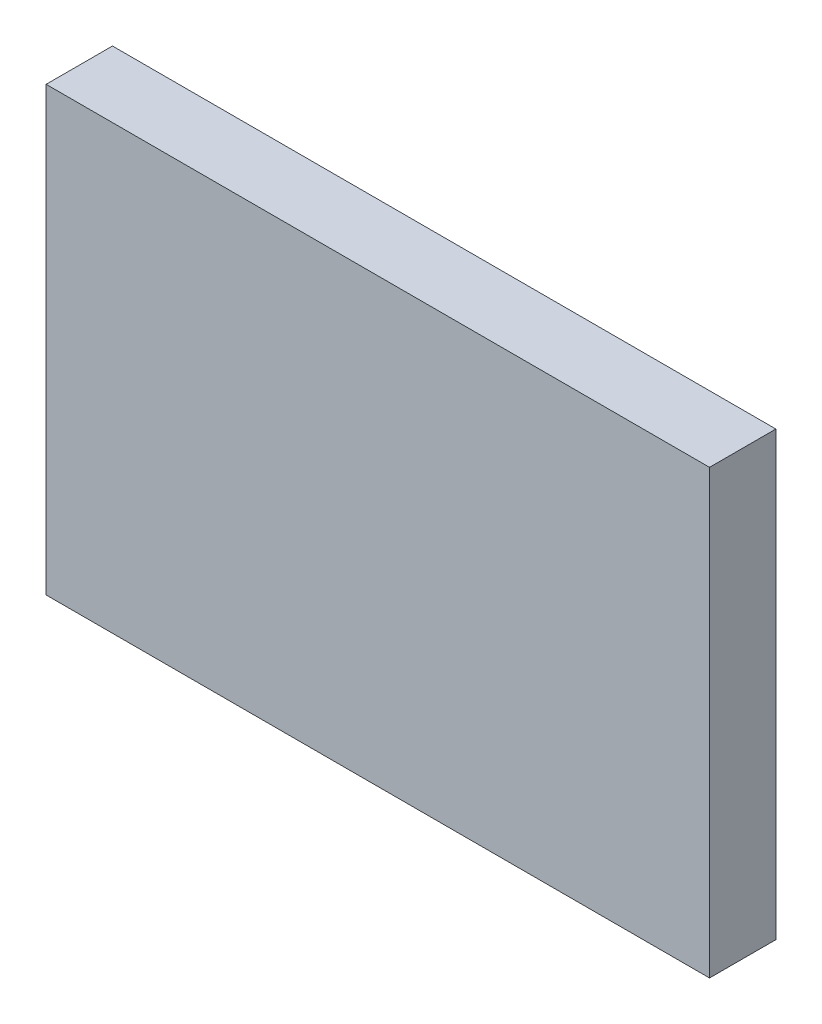
ISO-10303-21;
HEADER;
FILE_DESCRIPTION(('STEP AP214'),'2;1');
FILE_NAME('part.step','',(''),(''),'','','');
FILE_SCHEMA(('AUTOMOTIVE_DESIGN { 1 0 10303 214 1 1 1 1 }'));
ENDSEC;
DATA;
#1=APPLICATION_CONTEXT('core data for automotive mechanical design processes');
#2=APPLICATION_PROTOCOL_DEFINITION('international standard','automotive_design',2000,#1);
#3=PRODUCT_CONTEXT('',#1,'mechanical');
#4=PRODUCT('Part','Part','',(#3));
#5=PRODUCT_RELATED_PRODUCT_CATEGORY('part','',(#4));
#6=PRODUCT_DEFINITION_FORMATION('','',#4);
#7=PRODUCT_DEFINITION_CONTEXT('part definition',#1,'design');
#8=PRODUCT_DEFINITION('design','',#6,#7);
#9=PRODUCT_DEFINITION_SHAPE('','',#8);
#10=(LENGTH_UNIT() NAMED_UNIT(*) SI_UNIT(.MILLI.,.METRE.));
#11=(NAMED_UNIT(*) PLANE_ANGLE_UNIT() SI_UNIT($,.RADIAN.));
#12=(NAMED_UNIT(*) SI_UNIT($,.STERADIAN.) SOLID_ANGLE_UNIT());
#13=UNCERTAINTY_MEASURE_WITH_UNIT(LENGTH_MEASURE(1.E-05),#10,'distance_accuracy_value','');
#14=(GEOMETRIC_REPRESENTATION_CONTEXT(3) GLOBAL_UNCERTAINTY_ASSIGNED_CONTEXT((#13)) GLOBAL_UNIT_ASSIGNED_CONTEXT((#10,
#11,#12)) REPRESENTATION_CONTEXT('',''));
#15=CARTESIAN_POINT('',(0.,0.,0.));
#16=DIRECTION('',(0.,0.,1.));
#17=DIRECTION('',(1.,0.,0.));
#18=AXIS2_PLACEMENT_3D('',#15,#16,#17);
#19=CARTESIAN_POINT('',(15.,-10.,3.));
#20=DIRECTION('',(-1.,0.,0.));
#21=DIRECTION('',(0.,0.,1.));
#22=AXIS2_PLACEMENT_3D('',#19,#20,#21);
#23=PLANE('',#22);
#24=DIRECTION('',(0.,1.,0.));
#25=VECTOR('',#24,1.);
#26=CARTESIAN_POINT('',(15.,-10.,0.));
#27=LINE('',#26,#25);
#28=CARTESIAN_POINT('',(15.,-10.,0.));
#29=VERTEX_POINT('',#28);
#30=CARTESIAN_POINT('',(15.,10.,0.));
#31=VERTEX_POINT('',#30);
#32=EDGE_CURVE('E99',#29,#31,#27,.T.);
#33=ORIENTED_EDGE('',*,*,#32,.T.);
#34=DIRECTION('',(0.,0.,-1.));
#35=VECTOR('',#34,1.);
#36=CARTESIAN_POINT('',(15.,10.,3.));
#37=LINE('',#36,#35);
#38=CARTESIAN_POINT('',(15.,10.,3.));
#39=VERTEX_POINT('',#38);
#40=EDGE_CURVE('E11',#39,#31,#37,.T.);
#41=ORIENTED_EDGE('',*,*,#40,.F.);
#42=DIRECTION('',(0.,1.,0.));
#43=VECTOR('',#42,1.);
#44=CARTESIAN_POINT('',(15.,-10.,3.));
#45=LINE('',#44,#43);
#46=CARTESIAN_POINT('',(15.,-10.,3.));
#47=VERTEX_POINT('',#46);
#48=EDGE_CURVE('E87',#47,#39,#45,.T.);
#49=ORIENTED_EDGE('',*,*,#48,.F.);
#50=DIRECTION('',(0.,0.,-1.));
#51=VECTOR('',#50,1.);
#52=CARTESIAN_POINT('',(15.,-10.,3.));
#53=LINE('',#52,#51);
#54=EDGE_CURVE('E95',#47,#29,#53,.T.);
#55=ORIENTED_EDGE('',*,*,#54,.T.);
#56=EDGE_LOOP('',(#33,#41,#49,#55));
#57=FACE_BOUND('',#56,.T.);
#58=ADVANCED_FACE('F36',(#57),#23,.F.);
#59=CARTESIAN_POINT('',(-15.,10.,3.));
#60=DIRECTION('',(0.,-1.,0.));
#61=DIRECTION('',(0.,0.,-1.));
#62=AXIS2_PLACEMENT_3D('',#59,#60,#61);
#63=PLANE('',#62);
#64=DIRECTION('',(-1.,0.,0.));
#65=VECTOR('',#64,1.);
#66=CARTESIAN_POINT('',(-15.,10.,0.));
#67=LINE('',#66,#65);
#68=CARTESIAN_POINT('',(-15.,10.,0.));
#69=VERTEX_POINT('',#68);
#70=EDGE_CURVE('E91',#31,#69,#67,.T.);
#71=ORIENTED_EDGE('',*,*,#70,.T.);
#72=DIRECTION('',(0.,0.,-1.));
#73=VECTOR('',#72,1.);
#74=CARTESIAN_POINT('',(-15.,10.,3.));
#75=LINE('',#74,#73);
#76=CARTESIAN_POINT('',(-15.,10.,3.));
#77=VERTEX_POINT('',#76);
#78=EDGE_CURVE('E44',#77,#69,#75,.T.);
#79=ORIENTED_EDGE('',*,*,#78,.F.);
#80=DIRECTION('',(-1.,0.,0.));
#81=VECTOR('',#80,1.);
#82=CARTESIAN_POINT('',(-15.,10.,3.));
#83=LINE('',#82,#81);
#84=EDGE_CURVE('E82',#39,#77,#83,.T.);
#85=ORIENTED_EDGE('',*,*,#84,.F.);
#86=ORIENTED_EDGE('',*,*,#40,.T.);
#87=EDGE_LOOP('',(#71,#79,#85,#86));
#88=FACE_BOUND('',#87,.T.);
#89=ADVANCED_FACE('F90',(#88),#63,.F.);
#90=CARTESIAN_POINT('',(-15.,-10.,3.));
#91=DIRECTION('',(1.,0.,0.));
#92=DIRECTION('',(0.,0.,-1.));
#93=AXIS2_PLACEMENT_3D('',#90,#91,#92);
#94=PLANE('',#93);
#95=DIRECTION('',(0.,-1.,0.));
#96=VECTOR('',#95,1.);
#97=CARTESIAN_POINT('',(-15.,-10.,0.));
#98=LINE('',#97,#96);
#99=CARTESIAN_POINT('',(-15.,-10.,0.));
#100=VERTEX_POINT('',#99);
#101=EDGE_CURVE('E69',#69,#100,#98,.T.);
#102=ORIENTED_EDGE('',*,*,#101,.T.);
#103=DIRECTION('',(0.,0.,-1.));
#104=VECTOR('',#103,1.);
#105=CARTESIAN_POINT('',(-15.,-10.,3.));
#106=LINE('',#105,#104);
#107=CARTESIAN_POINT('',(-15.,-10.,3.));
#108=VERTEX_POINT('',#107);
#109=EDGE_CURVE('E92',#108,#100,#106,.T.);
#110=ORIENTED_EDGE('',*,*,#109,.F.);
#111=DIRECTION('',(0.,-1.,0.));
#112=VECTOR('',#111,1.);
#113=CARTESIAN_POINT('',(-15.,-10.,3.));
#114=LINE('',#113,#112);
#115=EDGE_CURVE('E85',#77,#108,#114,.T.);
#116=ORIENTED_EDGE('',*,*,#115,.F.);
#117=ORIENTED_EDGE('',*,*,#78,.T.);
#118=EDGE_LOOP('',(#102,#110,#116,#117));
#119=FACE_BOUND('',#118,.T.);
#120=ADVANCED_FACE('F93',(#119),#94,.F.);
#121=CARTESIAN_POINT('',(-15.,-10.,3.));
#122=DIRECTION('',(0.,1.,0.));
#123=DIRECTION('',(0.,0.,1.));
#124=AXIS2_PLACEMENT_3D('',#121,#122,#123);
#125=PLANE('',#124);
#126=DIRECTION('',(1.,0.,0.));
#127=VECTOR('',#126,1.);
#128=CARTESIAN_POINT('',(-15.,-10.,0.));
#129=LINE('',#128,#127);
#130=EDGE_CURVE('E75',#100,#29,#129,.T.);
#131=ORIENTED_EDGE('',*,*,#130,.T.);
#132=ORIENTED_EDGE('',*,*,#54,.F.);
#133=DIRECTION('',(1.,0.,0.));
#134=VECTOR('',#133,1.);
#135=CARTESIAN_POINT('',(-15.,-10.,3.));
#136=LINE('',#135,#134);
#137=EDGE_CURVE('E52',#108,#47,#136,.T.);
#138=ORIENTED_EDGE('',*,*,#137,.F.);
#139=ORIENTED_EDGE('',*,*,#109,.T.);
#140=EDGE_LOOP('',(#131,#132,#138,#139));
#141=FACE_BOUND('',#140,.T.);
#142=ADVANCED_FACE('F106',(#141),#125,.F.);
#143=CARTESIAN_POINT('',(0.,0.,3.));
#144=DIRECTION('',(0.,0.,-1.));
#145=DIRECTION('',(-1.,0.,0.));
#146=AXIS2_PLACEMENT_3D('',#143,#144,#145);
#147=PLANE('',#146);
#148=ORIENTED_EDGE('',*,*,#48,.T.);
#149=ORIENTED_EDGE('',*,*,#84,.T.);
#150=ORIENTED_EDGE('',*,*,#115,.T.);
#151=ORIENTED_EDGE('',*,*,#137,.T.);
#152=EDGE_LOOP('',(#148,#149,#150,#151));
#153=FACE_BOUND('',#152,.T.);
#154=ADVANCED_FACE('F83',(#153),#147,.F.);
#155=CARTESIAN_POINT('',(0.,0.,0.));
#156=DIRECTION('',(0.,0.,-1.));
#157=DIRECTION('',(-1.,0.,0.));
#158=AXIS2_PLACEMENT_3D('',#155,#156,#157);
#159=PLANE('',#158);
#160=ORIENTED_EDGE('',*,*,#32,.F.);
#161=ORIENTED_EDGE('',*,*,#130,.F.);
#162=ORIENTED_EDGE('',*,*,#101,.F.);
#163=ORIENTED_EDGE('',*,*,#70,.F.);
#164=EDGE_LOOP('',(#160,#161,#162,#163));
#165=FACE_BOUND('',#164,.T.);
#166=ADVANCED_FACE('F109',(#165),#159,.T.);
#167=CLOSED_SHELL('',(#58,#89,#120,#142,#154,#166));
#168=MANIFOLD_SOLID_BREP('B2',#167);
#169=ADVANCED_BREP_SHAPE_REPRESENTATION('',(#18,#168),#14);
#170=SHAPE_DEFINITION_REPRESENTATION(#9,#169);
ENDSEC;
END-ISO-10303-21;
